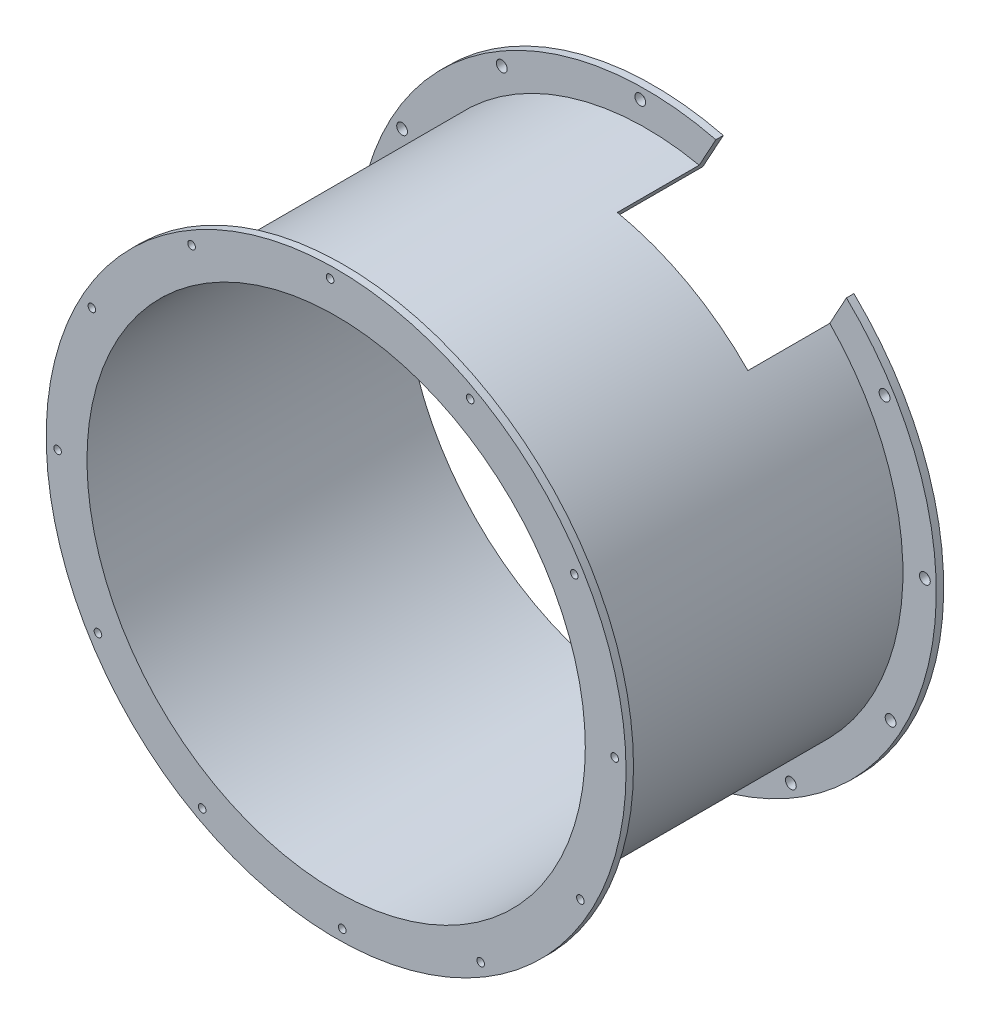
ISO-10303-21;
HEADER;
FILE_DESCRIPTION(('STEP AP214'),'2;1');
FILE_NAME('part.step','',(''),(''),'','','');
FILE_SCHEMA(('AUTOMOTIVE_DESIGN { 1 0 10303 214 1 1 1 1 }'));
ENDSEC;
DATA;
#1=APPLICATION_CONTEXT('core data for automotive mechanical design processes');
#2=APPLICATION_PROTOCOL_DEFINITION('international standard','automotive_design',2000,#1);
#3=PRODUCT_CONTEXT('',#1,'mechanical');
#4=PRODUCT('Part','Part','',(#3));
#5=PRODUCT_RELATED_PRODUCT_CATEGORY('part','',(#4));
#6=PRODUCT_DEFINITION_FORMATION('','',#4);
#7=PRODUCT_DEFINITION_CONTEXT('part definition',#1,'design');
#8=PRODUCT_DEFINITION('design','',#6,#7);
#9=PRODUCT_DEFINITION_SHAPE('','',#8);
#10=(LENGTH_UNIT() NAMED_UNIT(*) SI_UNIT(.MILLI.,.METRE.));
#11=(NAMED_UNIT(*) PLANE_ANGLE_UNIT() SI_UNIT($,.RADIAN.));
#12=(NAMED_UNIT(*) SI_UNIT($,.STERADIAN.) SOLID_ANGLE_UNIT());
#13=UNCERTAINTY_MEASURE_WITH_UNIT(LENGTH_MEASURE(1.E-05),#10,'distance_accuracy_value','');
#14=(GEOMETRIC_REPRESENTATION_CONTEXT(3) GLOBAL_UNCERTAINTY_ASSIGNED_CONTEXT((#13)) GLOBAL_UNIT_ASSIGNED_CONTEXT((#10,
#11,#12)) REPRESENTATION_CONTEXT('',''));
#15=CARTESIAN_POINT('',(0.,0.,0.));
#16=DIRECTION('',(0.,0.,1.));
#17=DIRECTION('',(1.,0.,0.));
#18=AXIS2_PLACEMENT_3D('',#15,#16,#17);
#19=CARTESIAN_POINT('',(0.,0.,-108.88502705223));
#20=DIRECTION('',(0.,0.,-1.));
#21=DIRECTION('',(-1.,0.,0.));
#22=AXIS2_PLACEMENT_3D('',#19,#20,#21);
#23=PLANE('',#22);
#24=CARTESIAN_POINT('',(-84.2552932690104,-59.1010315433568,-108.88502705223));
#25=DIRECTION('',(0.,0.,1.));
#26=DIRECTION('',(1.,0.,0.));
#27=AXIS2_PLACEMENT_3D('',#24,#25,#26);
#28=CIRCLE('',#27,1.45);
#29=CARTESIAN_POINT('',(-82.8052932690104,-59.1010315433568,-108.88502705223));
#30=VERTEX_POINT('',#29);
#31=EDGE_CURVE('E274',#30,#30,#28,.T.);
#32=ORIENTED_EDGE('',*,*,#31,.F.);
#33=EDGE_LOOP('',(#32));
#34=FACE_BOUND('',#33,.T.);
#35=CARTESIAN_POINT('',(-57.4334190667852,-31.0833742869837,-108.88502705223));
#36=DIRECTION('',(0.,0.,1.));
#37=DIRECTION('',(1.,0.,0.));
#38=AXIS2_PLACEMENT_3D('',#35,#36,#37);
#39=CIRCLE('',#38,1.45);
#40=CARTESIAN_POINT('',(-55.9834190667852,-31.0833742869837,-108.88502705223));
#41=VERTEX_POINT('',#40);
#42=EDGE_CURVE('E268',#41,#41,#39,.T.);
#43=ORIENTED_EDGE('',*,*,#42,.F.);
#44=EDGE_LOOP('',(#43));
#45=FACE_BOUND('',#44,.T.);
#46=CARTESIAN_POINT('',(-48.2138232587343,6.5915657526732,-108.88502705223));
#47=DIRECTION('',(0.,0.,1.));
#48=DIRECTION('',(1.,0.,0.));
#49=AXIS2_PLACEMENT_3D('',#46,#47,#48);
#50=CIRCLE('',#49,1.45);
#51=CARTESIAN_POINT('',(-46.7638232587343,6.5915657526732,-108.88502705223));
#52=VERTEX_POINT('',#51);
#53=EDGE_CURVE('E262',#52,#52,#50,.T.);
#54=ORIENTED_EDGE('',*,*,#53,.F.);
#55=EDGE_LOOP('',(#54));
#56=FACE_BOUND('',#55,.T.);
#57=CARTESIAN_POINT('',(-124.759486392196,79.8702888273732,-108.88502705223));
#58=DIRECTION('',(0.,0.,1.));
#59=DIRECTION('',(1.,0.,0.));
#60=AXIS2_PLACEMENT_3D('',#57,#58,#59);
#61=CIRCLE('',#60,1.45);
#62=CARTESIAN_POINT('',(-123.309486392196,79.8702888273732,-108.88502705223));
#63=VERTEX_POINT('',#62);
#64=EDGE_CURVE('E253',#63,#63,#61,.T.);
#65=ORIENTED_EDGE('',*,*,#64,.F.);
#66=EDGE_LOOP('',(#65));
#67=FACE_BOUND('',#66,.T.);
#68=CARTESIAN_POINT('',(-161.99673945662,69.0172229899414,-108.88502705223));
#69=DIRECTION('',(0.,0.,1.));
#70=DIRECTION('',(1.,0.,0.));
#71=AXIS2_PLACEMENT_3D('',#68,#69,#70);
#72=CIRCLE('',#71,1.45);
#73=CARTESIAN_POINT('',(-160.54673945662,69.0172229899414,-108.88502705223));
#74=VERTEX_POINT('',#73);
#75=EDGE_CURVE('E247',#74,#74,#72,.T.);
#76=ORIENTED_EDGE('',*,*,#75,.F.);
#77=EDGE_LOOP('',(#76));
#78=FACE_BOUND('',#77,.T.);
#79=CARTESIAN_POINT('',(-188.818613658845,40.9995657335684,-108.88502705223));
#80=DIRECTION('',(0.,0.,1.));
#81=DIRECTION('',(1.,0.,0.));
#82=AXIS2_PLACEMENT_3D('',#79,#80,#81);
#83=CIRCLE('',#82,1.45);
#84=CARTESIAN_POINT('',(-187.368613658845,40.9995657335684,-108.88502705223));
#85=VERTEX_POINT('',#84);
#86=EDGE_CURVE('E241',#85,#85,#83,.T.);
#87=ORIENTED_EDGE('',*,*,#86,.F.);
#88=EDGE_LOOP('',(#87));
#89=FACE_BOUND('',#88,.T.);
#90=CARTESIAN_POINT('',(-198.038209466896,3.32462569391143,-108.88502705223));
#91=DIRECTION('',(0.,0.,1.));
#92=DIRECTION('',(1.,0.,0.));
#93=AXIS2_PLACEMENT_3D('',#90,#91,#92);
#94=CIRCLE('',#93,1.45);
#95=CARTESIAN_POINT('',(-196.588209466896,3.32462569391143,-108.88502705223));
#96=VERTEX_POINT('',#95);
#97=EDGE_CURVE('E235',#96,#96,#94,.T.);
#98=ORIENTED_EDGE('',*,*,#97,.F.);
#99=EDGE_LOOP('',(#98));
#100=FACE_BOUND('',#99,.T.);
#101=CARTESIAN_POINT('',(-187.185143629464,-33.9126273705125,-108.88502705223));
#102=DIRECTION('',(0.,0.,1.));
#103=DIRECTION('',(1.,0.,0.));
#104=AXIS2_PLACEMENT_3D('',#101,#102,#103);
#105=CIRCLE('',#104,1.45);
#106=CARTESIAN_POINT('',(-185.735143629464,-33.9126273705125,-108.88502705223));
#107=VERTEX_POINT('',#106);
#108=EDGE_CURVE('E229',#107,#107,#105,.T.);
#109=ORIENTED_EDGE('',*,*,#108,.F.);
#110=EDGE_LOOP('',(#109));
#111=FACE_BOUND('',#110,.T.);
#112=CARTESIAN_POINT('',(-121.492546333434,-69.9540973807886,-108.88502705223));
#113=DIRECTION('',(0.,0.,1.));
#114=DIRECTION('',(1.,0.,0.));
#115=AXIS2_PLACEMENT_3D('',#112,#113,#114);
#116=CIRCLE('',#115,1.45);
#117=CARTESIAN_POINT('',(-120.042546333434,-69.9540973807886,-108.88502705223));
#118=VERTEX_POINT('',#117);
#119=EDGE_CURVE('E223',#118,#118,#116,.T.);
#120=ORIENTED_EDGE('',*,*,#119,.F.);
#121=EDGE_LOOP('',(#120));
#122=FACE_BOUND('',#121,.T.);
#123=CARTESIAN_POINT('',(-159.167486373091,-60.7345015727377,-108.88502705223));
#124=DIRECTION('',(0.,0.,1.));
#125=DIRECTION('',(1.,0.,0.));
#126=AXIS2_PLACEMENT_3D('',#123,#124,#125);
#127=CIRCLE('',#126,1.45);
#128=CARTESIAN_POINT('',(-157.717486373092,-60.7345015727377,-108.88502705223));
#129=VERTEX_POINT('',#128);
#130=EDGE_CURVE('E217',#129,#129,#127,.T.);
#131=ORIENTED_EDGE('',*,*,#130,.F.);
#132=EDGE_LOOP('',(#131));
#133=FACE_BOUND('',#132,.T.);
#134=CARTESIAN_POINT('',(-123.126016362815,4.95809572329235,-108.88502705223));
#135=DIRECTION('',(0.,0.,-1.));
#136=DIRECTION('',(-1.,0.,0.));
#137=AXIS2_PLACEMENT_3D('',#134,#135,#136);
#138=CIRCLE('',#137,69.0115996692059);
#139=CARTESIAN_POINT('',(-73.7894198728316,53.2126409567445,-108.88502705223));
#140=VERTEX_POINT('',#139);
#141=CARTESIAN_POINT('',(-108.90676901167,72.4889323364255,-108.88502705223));
#142=VERTEX_POINT('',#141);
#143=EDGE_CURVE('E92',#140,#142,#138,.T.);
#144=ORIENTED_EDGE('',*,*,#143,.T.);
#145=DIRECTION('',(0.481087899206272,0.876672363678299,0.));
#146=VECTOR('',#145,1.);
#147=CARTESIAN_POINT('',(-114.273456040525,62.7093760215189,-108.88502705223));
#148=LINE('',#147,#146);
#149=CARTESIAN_POINT('',(-104.422834049352,80.6598754602929,-108.88502705223));
#150=VERTEX_POINT('',#149);
#151=EDGE_CURVE('E26',#142,#150,#148,.T.);
#152=ORIENTED_EDGE('',*,*,#151,.T.);
#153=CARTESIAN_POINT('',(-123.126016362815,4.95809572329235,-108.88502705223));
#154=DIRECTION('',(0.,0.,-1.));
#155=DIRECTION('',(-1.,0.,0.));
#156=AXIS2_PLACEMENT_3D('',#153,#154,#155);
#157=CIRCLE('',#156,77.978);
#158=CARTESIAN_POINT('',(-69.3052195252026,61.3840676844774,-108.88502705223));
#159=VERTEX_POINT('',#158);
#160=EDGE_CURVE('E118',#159,#150,#157,.T.);
#161=ORIENTED_EDGE('',*,*,#160,.F.);
#162=DIRECTION('',(-0.481087899206272,-0.876672363678299,0.));
#163=VECTOR('',#162,1.);
#164=CARTESIAN_POINT('',(-79.1539611515719,43.4369947793157,-108.88502705223));
#165=LINE('',#164,#163);
#166=EDGE_CURVE('E126',#159,#140,#165,.T.);
#167=ORIENTED_EDGE('',*,*,#166,.T.);
#168=EDGE_LOOP('',(#144,#152,#161,#167));
#169=FACE_BOUND('',#168,.T.);
#170=CARTESIAN_POINT('',(-59.0668890961661,43.8288188170972,-108.88502705223));
#171=DIRECTION('',(0.,0.,1.));
#172=DIRECTION('',(1.,0.,0.));
#173=AXIS2_PLACEMENT_3D('',#170,#171,#172);
#174=CIRCLE('',#173,1.45);
#175=CARTESIAN_POINT('',(-57.6168890961661,43.8288188170972,-108.88502705223));
#176=VERTEX_POINT('',#175);
#177=EDGE_CURVE('E259',#176,#176,#174,.T.);
#178=ORIENTED_EDGE('',*,*,#177,.F.);
#179=EDGE_LOOP('',(#178));
#180=FACE_BOUND('',#179,.T.);
#181=ADVANCED_FACE('F17',(#34,#45,#56,#67,#78,#89,#100,#111,#122,#133,#169,#180),#23,.F.);
#182=CARTESIAN_POINT('',(-123.126016362815,4.95809572329235,45.));
#183=DIRECTION('',(0.,0.,-1.));
#184=DIRECTION('',(-1.,0.,0.));
#185=AXIS2_PLACEMENT_3D('',#182,#183,#184);
#186=CYLINDRICAL_SURFACE('',#185,69.0115996692059);
#187=DIRECTION('',(0.,0.,-1.));
#188=VECTOR('',#187,1.);
#189=CARTESIAN_POINT('',(-108.90676901167,72.4889323364255,45.));
#190=LINE('',#189,#188);
#191=CARTESIAN_POINT('',(-108.90676901167,72.4889323364255,-86.8650270522294));
#192=VERTEX_POINT('',#191);
#193=EDGE_CURVE('E101',#142,#192,#190,.F.);
#194=ORIENTED_EDGE('',*,*,#193,.F.);
#195=ORIENTED_EDGE('',*,*,#143,.F.);
#196=DIRECTION('',(0.,0.,-1.));
#197=VECTOR('',#196,1.);
#198=CARTESIAN_POINT('',(-73.7894198728316,53.2126409567445,45.));
#199=LINE('',#198,#197);
#200=CARTESIAN_POINT('',(-73.7894198728316,53.2126409567445,-86.8650270522294));
#201=VERTEX_POINT('',#200);
#202=EDGE_CURVE('E33',#201,#140,#199,.T.);
#203=ORIENTED_EDGE('',*,*,#202,.F.);
#204=CARTESIAN_POINT('',(-123.126016362815,4.95809572329235,-86.8650270522294));
#205=DIRECTION('',(0.,0.,-1.));
#206=DIRECTION('',(0.,1.,0.));
#207=AXIS2_PLACEMENT_3D('',#204,#205,#206);
#208=CIRCLE('',#207,69.0115996692059);
#209=EDGE_CURVE('E72',#201,#192,#208,.F.);
#210=ORIENTED_EDGE('',*,*,#209,.T.);
#211=EDGE_LOOP('',(#194,#195,#203,#210));
#212=FACE_BOUND('',#211,.T.);
#213=CARTESIAN_POINT('',(-123.126016362815,4.95809572329235,-27.4593849588588));
#214=DIRECTION('',(0.,0.,1.));
#215=DIRECTION('',(1.,0.,0.));
#216=AXIS2_PLACEMENT_3D('',#213,#214,#215);
#217=CIRCLE('',#216,69.0115996692059);
#218=CARTESIAN_POINT('',(-54.1144166936093,4.95809572329235,-27.4593849588588));
#219=VERTEX_POINT('',#218);
#220=EDGE_CURVE('E111',#219,#219,#217,.F.);
#221=ORIENTED_EDGE('',*,*,#220,.T.);
#222=EDGE_LOOP('',(#221));
#223=FACE_BOUND('',#222,.T.);
#224=ADVANCED_FACE('F89',(#212,#223),#186,.T.);
#225=CARTESIAN_POINT('',(-123.126016362815,4.95809572329235,3.));
#226=DIRECTION('',(0.,0.,-1.));
#227=DIRECTION('',(-1.,0.,0.));
#228=AXIS2_PLACEMENT_3D('',#225,#226,#227);
#229=CYLINDRICAL_SURFACE('',#228,67.0115996692059);
#230=CARTESIAN_POINT('',(-123.126016362815,4.95809572329235,-110.88502705223));
#231=DIRECTION('',(0.,0.,1.));
#232=DIRECTION('',(1.,0.,0.));
#233=AXIS2_PLACEMENT_3D('',#230,#231,#232);
#234=CIRCLE('',#233,67.0115996692059);
#235=CARTESIAN_POINT('',(-109.913575106506,70.6542591293428,-110.88502705223));
#236=VERTEX_POINT('',#235);
#237=CARTESIAN_POINT('',(-74.7962961921203,51.3778397817018,-110.88502705223));
#238=VERTEX_POINT('',#237);
#239=EDGE_CURVE('E121',#236,#238,#234,.T.);
#240=ORIENTED_EDGE('',*,*,#239,.F.);
#241=DIRECTION('',(0.,0.,-1.));
#242=VECTOR('',#241,1.);
#243=CARTESIAN_POINT('',(-109.913575106506,70.6542591293428,3.));
#244=LINE('',#243,#242);
#245=CARTESIAN_POINT('',(-109.913575106506,70.6542591293428,-86.8650270522294));
#246=VERTEX_POINT('',#245);
#247=EDGE_CURVE('E81',#236,#246,#244,.F.);
#248=ORIENTED_EDGE('',*,*,#247,.T.);
#249=CARTESIAN_POINT('',(-123.126016362815,4.95809572329235,-86.8650270522294));
#250=DIRECTION('',(0.,0.,-1.));
#251=DIRECTION('',(0.,1.,0.));
#252=AXIS2_PLACEMENT_3D('',#249,#250,#251);
#253=CIRCLE('',#252,67.0115996692059);
#254=CARTESIAN_POINT('',(-74.7962961921203,51.3778397817018,-86.8650270522294));
#255=VERTEX_POINT('',#254);
#256=EDGE_CURVE('E11',#255,#246,#253,.F.);
#257=ORIENTED_EDGE('',*,*,#256,.F.);
#258=DIRECTION('',(0.,0.,-1.));
#259=VECTOR('',#258,1.);
#260=CARTESIAN_POINT('',(-74.7962961921203,51.3778397817018,3.));
#261=LINE('',#260,#259);
#262=EDGE_CURVE('E85',#255,#238,#261,.T.);
#263=ORIENTED_EDGE('',*,*,#262,.T.);
#264=EDGE_LOOP('',(#240,#248,#257,#263));
#265=FACE_BOUND('',#264,.T.);
#266=CARTESIAN_POINT('',(-123.126016362815,4.95809572329235,-25.4593849588588));
#267=DIRECTION('',(0.,0.,1.));
#268=DIRECTION('',(1.,0.,0.));
#269=AXIS2_PLACEMENT_3D('',#266,#267,#268);
#270=CIRCLE('',#269,67.0115996692059);
#271=CARTESIAN_POINT('',(-56.1144166936093,4.95809572329235,-25.4593849588588));
#272=VERTEX_POINT('',#271);
#273=EDGE_CURVE('E108',#272,#272,#270,.F.);
#274=ORIENTED_EDGE('',*,*,#273,.F.);
#275=EDGE_LOOP('',(#274));
#276=FACE_BOUND('',#275,.T.);
#277=ADVANCED_FACE('F311',(#265,#276),#229,.F.);
#278=CARTESIAN_POINT('',(-123.126016362815,4.95809572329235,-110.88502705223));
#279=DIRECTION('',(0.,0.,1.));
#280=DIRECTION('',(1.,0.,0.));
#281=AXIS2_PLACEMENT_3D('',#278,#279,#280);
#282=PLANE('',#281);
#283=CARTESIAN_POINT('',(-84.2552932690104,-59.1010315433568,-110.88502705223));
#284=DIRECTION('',(0.,0.,1.));
#285=DIRECTION('',(1.,0.,0.));
#286=AXIS2_PLACEMENT_3D('',#283,#284,#285);
#287=CIRCLE('',#286,1.45);
#288=CARTESIAN_POINT('',(-82.8052932690104,-59.1010315433568,-110.88502705223));
#289=VERTEX_POINT('',#288);
#290=EDGE_CURVE('E271',#289,#289,#287,.T.);
#291=ORIENTED_EDGE('',*,*,#290,.T.);
#292=EDGE_LOOP('',(#291));
#293=FACE_BOUND('',#292,.T.);
#294=CARTESIAN_POINT('',(-57.4334190667852,-31.0833742869837,-110.88502705223));
#295=DIRECTION('',(0.,0.,1.));
#296=DIRECTION('',(1.,0.,0.));
#297=AXIS2_PLACEMENT_3D('',#294,#295,#296);
#298=CIRCLE('',#297,1.45);
#299=CARTESIAN_POINT('',(-55.9834190667852,-31.0833742869837,-110.88502705223));
#300=VERTEX_POINT('',#299);
#301=EDGE_CURVE('E265',#300,#300,#298,.T.);
#302=ORIENTED_EDGE('',*,*,#301,.T.);
#303=EDGE_LOOP('',(#302));
#304=FACE_BOUND('',#303,.T.);
#305=CARTESIAN_POINT('',(-48.2138232587343,6.5915657526732,-110.88502705223));
#306=DIRECTION('',(0.,0.,1.));
#307=DIRECTION('',(1.,0.,0.));
#308=AXIS2_PLACEMENT_3D('',#305,#306,#307);
#309=CIRCLE('',#308,1.45);
#310=CARTESIAN_POINT('',(-46.7638232587343,6.5915657526732,-110.88502705223));
#311=VERTEX_POINT('',#310);
#312=EDGE_CURVE('E21',#311,#311,#309,.T.);
#313=ORIENTED_EDGE('',*,*,#312,.T.);
#314=EDGE_LOOP('',(#313));
#315=FACE_BOUND('',#314,.T.);
#316=CARTESIAN_POINT('',(-59.0668890961661,43.8288188170972,-110.88502705223));
#317=DIRECTION('',(0.,0.,1.));
#318=DIRECTION('',(1.,0.,0.));
#319=AXIS2_PLACEMENT_3D('',#316,#317,#318);
#320=CIRCLE('',#319,1.45);
#321=CARTESIAN_POINT('',(-57.6168890961661,43.8288188170972,-110.88502705223));
#322=VERTEX_POINT('',#321);
#323=EDGE_CURVE('E256',#322,#322,#320,.T.);
#324=ORIENTED_EDGE('',*,*,#323,.T.);
#325=EDGE_LOOP('',(#324));
#326=FACE_BOUND('',#325,.T.);
#327=CARTESIAN_POINT('',(-124.759486392196,79.8702888273732,-110.88502705223));
#328=DIRECTION('',(0.,0.,1.));
#329=DIRECTION('',(1.,0.,0.));
#330=AXIS2_PLACEMENT_3D('',#327,#328,#329);
#331=CIRCLE('',#330,1.45);
#332=CARTESIAN_POINT('',(-123.309486392196,79.8702888273732,-110.88502705223));
#333=VERTEX_POINT('',#332);
#334=EDGE_CURVE('E250',#333,#333,#331,.T.);
#335=ORIENTED_EDGE('',*,*,#334,.T.);
#336=EDGE_LOOP('',(#335));
#337=FACE_BOUND('',#336,.T.);
#338=CARTESIAN_POINT('',(-161.99673945662,69.0172229899414,-110.88502705223));
#339=DIRECTION('',(0.,0.,1.));
#340=DIRECTION('',(1.,0.,0.));
#341=AXIS2_PLACEMENT_3D('',#338,#339,#340);
#342=CIRCLE('',#341,1.45);
#343=CARTESIAN_POINT('',(-160.54673945662,69.0172229899414,-110.88502705223));
#344=VERTEX_POINT('',#343);
#345=EDGE_CURVE('E244',#344,#344,#342,.T.);
#346=ORIENTED_EDGE('',*,*,#345,.T.);
#347=EDGE_LOOP('',(#346));
#348=FACE_BOUND('',#347,.T.);
#349=CARTESIAN_POINT('',(-188.818613658845,40.9995657335684,-110.88502705223));
#350=DIRECTION('',(0.,0.,1.));
#351=DIRECTION('',(1.,0.,0.));
#352=AXIS2_PLACEMENT_3D('',#349,#350,#351);
#353=CIRCLE('',#352,1.45);
#354=CARTESIAN_POINT('',(-187.368613658845,40.9995657335684,-110.88502705223));
#355=VERTEX_POINT('',#354);
#356=EDGE_CURVE('E238',#355,#355,#353,.T.);
#357=ORIENTED_EDGE('',*,*,#356,.T.);
#358=EDGE_LOOP('',(#357));
#359=FACE_BOUND('',#358,.T.);
#360=CARTESIAN_POINT('',(-198.038209466896,3.32462569391143,-110.88502705223));
#361=DIRECTION('',(0.,0.,1.));
#362=DIRECTION('',(1.,0.,0.));
#363=AXIS2_PLACEMENT_3D('',#360,#361,#362);
#364=CIRCLE('',#363,1.45);
#365=CARTESIAN_POINT('',(-196.588209466896,3.32462569391143,-110.88502705223));
#366=VERTEX_POINT('',#365);
#367=EDGE_CURVE('E232',#366,#366,#364,.T.);
#368=ORIENTED_EDGE('',*,*,#367,.T.);
#369=EDGE_LOOP('',(#368));
#370=FACE_BOUND('',#369,.T.);
#371=CARTESIAN_POINT('',(-187.185143629464,-33.9126273705125,-110.88502705223));
#372=DIRECTION('',(0.,0.,1.));
#373=DIRECTION('',(1.,0.,0.));
#374=AXIS2_PLACEMENT_3D('',#371,#372,#373);
#375=CIRCLE('',#374,1.45);
#376=CARTESIAN_POINT('',(-185.735143629464,-33.9126273705125,-110.88502705223));
#377=VERTEX_POINT('',#376);
#378=EDGE_CURVE('E226',#377,#377,#375,.T.);
#379=ORIENTED_EDGE('',*,*,#378,.T.);
#380=EDGE_LOOP('',(#379));
#381=FACE_BOUND('',#380,.T.);
#382=CARTESIAN_POINT('',(-121.492546333434,-69.9540973807886,-110.88502705223));
#383=DIRECTION('',(0.,0.,1.));
#384=DIRECTION('',(1.,0.,0.));
#385=AXIS2_PLACEMENT_3D('',#382,#383,#384);
#386=CIRCLE('',#385,1.45);
#387=CARTESIAN_POINT('',(-120.042546333434,-69.9540973807886,-110.88502705223));
#388=VERTEX_POINT('',#387);
#389=EDGE_CURVE('E220',#388,#388,#386,.T.);
#390=ORIENTED_EDGE('',*,*,#389,.T.);
#391=EDGE_LOOP('',(#390));
#392=FACE_BOUND('',#391,.T.);
#393=CARTESIAN_POINT('',(-159.167486373091,-60.7345015727377,-110.88502705223));
#394=DIRECTION('',(0.,0.,1.));
#395=DIRECTION('',(1.,0.,0.));
#396=AXIS2_PLACEMENT_3D('',#393,#394,#395);
#397=CIRCLE('',#396,1.45);
#398=CARTESIAN_POINT('',(-157.717486373092,-60.7345015727377,-110.88502705223));
#399=VERTEX_POINT('',#398);
#400=EDGE_CURVE('E214',#399,#399,#397,.T.);
#401=ORIENTED_EDGE('',*,*,#400,.T.);
#402=EDGE_LOOP('',(#401));
#403=FACE_BOUND('',#402,.T.);
#404=CARTESIAN_POINT('',(-123.126016362815,4.95809572329235,-110.88502705223));
#405=DIRECTION('',(0.,0.,-1.));
#406=DIRECTION('',(-1.,0.,0.));
#407=AXIS2_PLACEMENT_3D('',#404,#405,#406);
#408=CIRCLE('',#407,77.978);
#409=CARTESIAN_POINT('',(-69.3052195252026,61.3840676844773,-110.88502705223));
#410=VERTEX_POINT('',#409);
#411=CARTESIAN_POINT('',(-104.422834049351,80.6598754602929,-110.88502705223));
#412=VERTEX_POINT('',#411);
#413=EDGE_CURVE('E116',#410,#412,#408,.T.);
#414=ORIENTED_EDGE('',*,*,#413,.T.);
#415=DIRECTION('',(-0.481087899206272,-0.876672363678299,0.));
#416=VECTOR('',#415,1.);
#417=CARTESIAN_POINT('',(-99.1991805644907,90.1787859445615,-110.88502705223));
#418=LINE('',#417,#416);
#419=EDGE_CURVE('E96',#412,#236,#418,.T.);
#420=ORIENTED_EDGE('',*,*,#419,.T.);
#421=ORIENTED_EDGE('',*,*,#239,.T.);
#422=DIRECTION('',(0.481087899206272,0.876672363678299,0.));
#423=VECTOR('',#422,1.);
#424=CARTESIAN_POINT('',(-84.9021321289838,32.9622714576343,-110.88502705223));
#425=LINE('',#424,#423);
#426=EDGE_CURVE('E86',#238,#410,#425,.T.);
#427=ORIENTED_EDGE('',*,*,#426,.T.);
#428=EDGE_LOOP('',(#414,#420,#421,#427));
#429=FACE_BOUND('',#428,.T.);
#430=ADVANCED_FACE('F19',(#293,#304,#315,#326,#337,#348,#359,#370,#381,#392,#403,#429),#282,.F.);
#431=CARTESIAN_POINT('',(-123.126016362815,4.95809572329235,-108.88502705223));
#432=DIRECTION('',(0.,0.,-1.));
#433=DIRECTION('',(-1.,0.,0.));
#434=AXIS2_PLACEMENT_3D('',#431,#432,#433);
#435=CYLINDRICAL_SURFACE('',#434,77.978);
#436=DIRECTION('',(0.,0.,-1.));
#437=VECTOR('',#436,1.);
#438=CARTESIAN_POINT('',(-104.422834049351,80.6598754602929,-108.88502705223));
#439=LINE('',#438,#437);
#440=EDGE_CURVE('E41',#412,#150,#439,.F.);
#441=ORIENTED_EDGE('',*,*,#440,.F.);
#442=ORIENTED_EDGE('',*,*,#413,.F.);
#443=DIRECTION('',(0.,0.,-1.));
#444=VECTOR('',#443,1.);
#445=CARTESIAN_POINT('',(-69.3052195252026,61.3840676844773,-108.88502705223));
#446=LINE('',#445,#444);
#447=EDGE_CURVE('E93',#159,#410,#446,.T.);
#448=ORIENTED_EDGE('',*,*,#447,.F.);
#449=ORIENTED_EDGE('',*,*,#160,.T.);
#450=EDGE_LOOP('',(#441,#442,#448,#449));
#451=FACE_BOUND('',#450,.T.);
#452=ADVANCED_FACE('F133',(#451),#435,.T.);
#453=CARTESIAN_POINT('',(-123.126016362815,4.95809572329235,-25.4593849588588));
#454=DIRECTION('',(0.,0.,-1.));
#455=DIRECTION('',(-1.,0.,0.));
#456=AXIS2_PLACEMENT_3D('',#453,#454,#455);
#457=CYLINDRICAL_SURFACE('',#456,77.978);
#458=CARTESIAN_POINT('',(-123.126016362815,4.95809572329235,-25.4593849588588));
#459=DIRECTION('',(0.,0.,1.));
#460=DIRECTION('',(1.,0.,0.));
#461=AXIS2_PLACEMENT_3D('',#458,#459,#460);
#462=CIRCLE('',#461,77.978);
#463=CARTESIAN_POINT('',(-45.1480163628152,4.95809572329235,-25.4593849588588));
#464=VERTEX_POINT('',#463);
#465=EDGE_CURVE('E105',#464,#464,#462,.T.);
#466=ORIENTED_EDGE('',*,*,#465,.F.);
#467=EDGE_LOOP('',(#466));
#468=FACE_BOUND('',#467,.T.);
#469=CARTESIAN_POINT('',(-123.126016362815,4.95809572329235,-27.4593849588588));
#470=DIRECTION('',(0.,0.,1.));
#471=DIRECTION('',(1.,0.,0.));
#472=AXIS2_PLACEMENT_3D('',#469,#470,#471);
#473=CIRCLE('',#472,77.978);
#474=CARTESIAN_POINT('',(-45.1480163628152,4.95809572329235,-27.4593849588588));
#475=VERTEX_POINT('',#474);
#476=EDGE_CURVE('E80',#475,#475,#473,.T.);
#477=ORIENTED_EDGE('',*,*,#476,.T.);
#478=EDGE_LOOP('',(#477));
#479=FACE_BOUND('',#478,.T.);
#480=ADVANCED_FACE('F319',(#468,#479),#457,.T.);
#481=CARTESIAN_POINT('',(0.,0.,-25.4593849588588));
#482=DIRECTION('',(0.,0.,1.));
#483=DIRECTION('',(1.,0.,0.));
#484=AXIS2_PLACEMENT_3D('',#481,#482,#483);
#485=PLANE('',#484);
#486=CARTESIAN_POINT('',(-57.4334190667852,-31.0833742869837,-25.4593849588588));
#487=DIRECTION('',(0.,0.,1.));
#488=DIRECTION('',(1.,0.,0.));
#489=AXIS2_PLACEMENT_3D('',#486,#487,#488);
#490=CIRCLE('',#489,1.025);
#491=CARTESIAN_POINT('',(-56.4084190667852,-31.0833742869837,-25.4593849588588));
#492=VERTEX_POINT('',#491);
#493=EDGE_CURVE('E211',#492,#492,#490,.T.);
#494=ORIENTED_EDGE('',*,*,#493,.F.);
#495=EDGE_LOOP('',(#494));
#496=FACE_BOUND('',#495,.T.);
#497=CARTESIAN_POINT('',(-84.2552932690104,-59.1010315433568,-25.4593849588588));
#498=DIRECTION('',(0.,0.,1.));
#499=DIRECTION('',(1.,0.,0.));
#500=AXIS2_PLACEMENT_3D('',#497,#498,#499);
#501=CIRCLE('',#500,1.025);
#502=CARTESIAN_POINT('',(-83.2302932690104,-59.1010315433568,-25.4593849588588));
#503=VERTEX_POINT('',#502);
#504=EDGE_CURVE('E205',#503,#503,#501,.T.);
#505=ORIENTED_EDGE('',*,*,#504,.F.);
#506=EDGE_LOOP('',(#505));
#507=FACE_BOUND('',#506,.T.);
#508=CARTESIAN_POINT('',(-121.492546333434,-69.9540973807886,-25.4593849588588));
#509=DIRECTION('',(0.,0.,1.));
#510=DIRECTION('',(1.,0.,0.));
#511=AXIS2_PLACEMENT_3D('',#508,#509,#510);
#512=CIRCLE('',#511,1.025);
#513=CARTESIAN_POINT('',(-120.467546333434,-69.9540973807886,-25.4593849588588));
#514=VERTEX_POINT('',#513);
#515=EDGE_CURVE('E199',#514,#514,#512,.T.);
#516=ORIENTED_EDGE('',*,*,#515,.F.);
#517=EDGE_LOOP('',(#516));
#518=FACE_BOUND('',#517,.T.);
#519=CARTESIAN_POINT('',(-159.167486373091,-60.7345015727377,-25.4593849588588));
#520=DIRECTION('',(0.,0.,1.));
#521=DIRECTION('',(1.,0.,0.));
#522=AXIS2_PLACEMENT_3D('',#519,#520,#521);
#523=CIRCLE('',#522,1.025);
#524=CARTESIAN_POINT('',(-158.142486373092,-60.7345015727377,-25.4593849588588));
#525=VERTEX_POINT('',#524);
#526=EDGE_CURVE('E193',#525,#525,#523,.T.);
#527=ORIENTED_EDGE('',*,*,#526,.F.);
#528=EDGE_LOOP('',(#527));
#529=FACE_BOUND('',#528,.T.);
#530=CARTESIAN_POINT('',(-187.185143629464,-33.9126273705125,-25.4593849588588));
#531=DIRECTION('',(0.,0.,1.));
#532=DIRECTION('',(1.,0.,0.));
#533=AXIS2_PLACEMENT_3D('',#530,#531,#532);
#534=CIRCLE('',#533,1.025);
#535=CARTESIAN_POINT('',(-186.160143629464,-33.9126273705125,-25.4593849588588));
#536=VERTEX_POINT('',#535);
#537=EDGE_CURVE('E187',#536,#536,#534,.T.);
#538=ORIENTED_EDGE('',*,*,#537,.F.);
#539=EDGE_LOOP('',(#538));
#540=FACE_BOUND('',#539,.T.);
#541=CARTESIAN_POINT('',(-198.038209466896,3.32462569391143,-25.4593849588588));
#542=DIRECTION('',(0.,0.,1.));
#543=DIRECTION('',(1.,0.,0.));
#544=AXIS2_PLACEMENT_3D('',#541,#542,#543);
#545=CIRCLE('',#544,1.025);
#546=CARTESIAN_POINT('',(-197.013209466896,3.32462569391143,-25.4593849588588));
#547=VERTEX_POINT('',#546);
#548=EDGE_CURVE('E181',#547,#547,#545,.T.);
#549=ORIENTED_EDGE('',*,*,#548,.F.);
#550=EDGE_LOOP('',(#549));
#551=FACE_BOUND('',#550,.T.);
#552=CARTESIAN_POINT('',(-188.818613658845,40.9995657335684,-25.4593849588588));
#553=DIRECTION('',(0.,0.,1.));
#554=DIRECTION('',(1.,0.,0.));
#555=AXIS2_PLACEMENT_3D('',#552,#553,#554);
#556=CIRCLE('',#555,1.025);
#557=CARTESIAN_POINT('',(-187.793613658845,40.9995657335684,-25.4593849588588));
#558=VERTEX_POINT('',#557);
#559=EDGE_CURVE('E175',#558,#558,#556,.T.);
#560=ORIENTED_EDGE('',*,*,#559,.F.);
#561=EDGE_LOOP('',(#560));
#562=FACE_BOUND('',#561,.T.);
#563=CARTESIAN_POINT('',(-161.99673945662,69.0172229899414,-25.4593849588588));
#564=DIRECTION('',(0.,0.,1.));
#565=DIRECTION('',(1.,0.,0.));
#566=AXIS2_PLACEMENT_3D('',#563,#564,#565);
#567=CIRCLE('',#566,1.025);
#568=CARTESIAN_POINT('',(-160.97173945662,69.0172229899414,-25.4593849588588));
#569=VERTEX_POINT('',#568);
#570=EDGE_CURVE('E169',#569,#569,#567,.T.);
#571=ORIENTED_EDGE('',*,*,#570,.F.);
#572=EDGE_LOOP('',(#571));
#573=FACE_BOUND('',#572,.T.);
#574=CARTESIAN_POINT('',(-124.759486392196,79.8702888273732,-25.4593849588588));
#575=DIRECTION('',(0.,0.,1.));
#576=DIRECTION('',(1.,0.,0.));
#577=AXIS2_PLACEMENT_3D('',#574,#575,#576);
#578=CIRCLE('',#577,1.025);
#579=CARTESIAN_POINT('',(-123.734486392196,79.8702888273732,-25.4593849588588));
#580=VERTEX_POINT('',#579);
#581=EDGE_CURVE('E163',#580,#580,#578,.T.);
#582=ORIENTED_EDGE('',*,*,#581,.F.);
#583=EDGE_LOOP('',(#582));
#584=FACE_BOUND('',#583,.T.);
#585=CARTESIAN_POINT('',(-87.0845463525391,70.6506930193223,-25.4593849588588));
#586=DIRECTION('',(0.,0.,1.));
#587=DIRECTION('',(1.,0.,0.));
#588=AXIS2_PLACEMENT_3D('',#585,#586,#587);
#589=CIRCLE('',#588,1.025);
#590=CARTESIAN_POINT('',(-86.0595463525391,70.6506930193223,-25.4593849588588));
#591=VERTEX_POINT('',#590);
#592=EDGE_CURVE('E157',#591,#591,#589,.T.);
#593=ORIENTED_EDGE('',*,*,#592,.F.);
#594=EDGE_LOOP('',(#593));
#595=FACE_BOUND('',#594,.T.);
#596=CARTESIAN_POINT('',(-59.0668890961661,43.8288188170972,-25.4593849588588));
#597=DIRECTION('',(0.,0.,1.));
#598=DIRECTION('',(1.,0.,0.));
#599=AXIS2_PLACEMENT_3D('',#596,#597,#598);
#600=CIRCLE('',#599,1.025);
#601=CARTESIAN_POINT('',(-58.0418890961661,43.8288188170972,-25.4593849588588));
#602=VERTEX_POINT('',#601);
#603=EDGE_CURVE('E151',#602,#602,#600,.T.);
#604=ORIENTED_EDGE('',*,*,#603,.F.);
#605=EDGE_LOOP('',(#604));
#606=FACE_BOUND('',#605,.T.);
#607=CARTESIAN_POINT('',(-48.2138232587343,6.5915657526732,-25.4593849588588));
#608=DIRECTION('',(0.,0.,1.));
#609=DIRECTION('',(1.,0.,0.));
#610=AXIS2_PLACEMENT_3D('',#607,#608,#609);
#611=CIRCLE('',#610,1.025);
#612=CARTESIAN_POINT('',(-47.1888232587343,6.5915657526732,-25.4593849588588));
#613=VERTEX_POINT('',#612);
#614=EDGE_CURVE('E145',#613,#613,#611,.T.);
#615=ORIENTED_EDGE('',*,*,#614,.F.);
#616=EDGE_LOOP('',(#615));
#617=FACE_BOUND('',#616,.T.);
#618=ORIENTED_EDGE('',*,*,#465,.T.);
#619=EDGE_LOOP('',(#618));
#620=FACE_BOUND('',#619,.T.);
#621=ORIENTED_EDGE('',*,*,#273,.T.);
#622=EDGE_LOOP('',(#621));
#623=FACE_BOUND('',#622,.T.);
#624=ADVANCED_FACE('F411',(#496,#507,#518,#529,#540,#551,#562,#573,#584,#595,#606,#617,#620,
#623),#485,.T.);
#625=CARTESIAN_POINT('',(0.,0.,-27.4593849588588));
#626=DIRECTION('',(0.,0.,1.));
#627=DIRECTION('',(1.,0.,0.));
#628=AXIS2_PLACEMENT_3D('',#625,#626,#627);
#629=PLANE('',#628);
#630=CARTESIAN_POINT('',(-57.4334190667852,-31.0833742869837,-27.4593849588588));
#631=DIRECTION('',(0.,0.,1.));
#632=DIRECTION('',(1.,0.,0.));
#633=AXIS2_PLACEMENT_3D('',#630,#631,#632);
#634=CIRCLE('',#633,1.025);
#635=CARTESIAN_POINT('',(-56.4084190667852,-31.0833742869837,-27.4593849588588));
#636=VERTEX_POINT('',#635);
#637=EDGE_CURVE('E208',#636,#636,#634,.T.);
#638=ORIENTED_EDGE('',*,*,#637,.T.);
#639=EDGE_LOOP('',(#638));
#640=FACE_BOUND('',#639,.T.);
#641=CARTESIAN_POINT('',(-84.2552932690104,-59.1010315433568,-27.4593849588588));
#642=DIRECTION('',(0.,0.,1.));
#643=DIRECTION('',(1.,0.,0.));
#644=AXIS2_PLACEMENT_3D('',#641,#642,#643);
#645=CIRCLE('',#644,1.025);
#646=CARTESIAN_POINT('',(-83.2302932690104,-59.1010315433568,-27.4593849588588));
#647=VERTEX_POINT('',#646);
#648=EDGE_CURVE('E202',#647,#647,#645,.T.);
#649=ORIENTED_EDGE('',*,*,#648,.T.);
#650=EDGE_LOOP('',(#649));
#651=FACE_BOUND('',#650,.T.);
#652=CARTESIAN_POINT('',(-121.492546333434,-69.9540973807886,-27.4593849588588));
#653=DIRECTION('',(0.,0.,1.));
#654=DIRECTION('',(1.,0.,0.));
#655=AXIS2_PLACEMENT_3D('',#652,#653,#654);
#656=CIRCLE('',#655,1.025);
#657=CARTESIAN_POINT('',(-120.467546333434,-69.9540973807886,-27.4593849588588));
#658=VERTEX_POINT('',#657);
#659=EDGE_CURVE('E196',#658,#658,#656,.T.);
#660=ORIENTED_EDGE('',*,*,#659,.T.);
#661=EDGE_LOOP('',(#660));
#662=FACE_BOUND('',#661,.T.);
#663=CARTESIAN_POINT('',(-159.167486373091,-60.7345015727377,-27.4593849588588));
#664=DIRECTION('',(0.,0.,1.));
#665=DIRECTION('',(1.,0.,0.));
#666=AXIS2_PLACEMENT_3D('',#663,#664,#665);
#667=CIRCLE('',#666,1.025);
#668=CARTESIAN_POINT('',(-158.142486373092,-60.7345015727377,-27.4593849588588));
#669=VERTEX_POINT('',#668);
#670=EDGE_CURVE('E190',#669,#669,#667,.T.);
#671=ORIENTED_EDGE('',*,*,#670,.T.);
#672=EDGE_LOOP('',(#671));
#673=FACE_BOUND('',#672,.T.);
#674=CARTESIAN_POINT('',(-187.185143629464,-33.9126273705125,-27.4593849588588));
#675=DIRECTION('',(0.,0.,1.));
#676=DIRECTION('',(1.,0.,0.));
#677=AXIS2_PLACEMENT_3D('',#674,#675,#676);
#678=CIRCLE('',#677,1.025);
#679=CARTESIAN_POINT('',(-186.160143629464,-33.9126273705125,-27.4593849588588));
#680=VERTEX_POINT('',#679);
#681=EDGE_CURVE('E184',#680,#680,#678,.T.);
#682=ORIENTED_EDGE('',*,*,#681,.T.);
#683=EDGE_LOOP('',(#682));
#684=FACE_BOUND('',#683,.T.);
#685=CARTESIAN_POINT('',(-198.038209466896,3.32462569391143,-27.4593849588588));
#686=DIRECTION('',(0.,0.,1.));
#687=DIRECTION('',(1.,0.,0.));
#688=AXIS2_PLACEMENT_3D('',#685,#686,#687);
#689=CIRCLE('',#688,1.025);
#690=CARTESIAN_POINT('',(-197.013209466896,3.32462569391143,-27.4593849588588));
#691=VERTEX_POINT('',#690);
#692=EDGE_CURVE('E178',#691,#691,#689,.T.);
#693=ORIENTED_EDGE('',*,*,#692,.T.);
#694=EDGE_LOOP('',(#693));
#695=FACE_BOUND('',#694,.T.);
#696=CARTESIAN_POINT('',(-188.818613658845,40.9995657335684,-27.4593849588588));
#697=DIRECTION('',(0.,0.,1.));
#698=DIRECTION('',(1.,0.,0.));
#699=AXIS2_PLACEMENT_3D('',#696,#697,#698);
#700=CIRCLE('',#699,1.025);
#701=CARTESIAN_POINT('',(-187.793613658845,40.9995657335684,-27.4593849588588));
#702=VERTEX_POINT('',#701);
#703=EDGE_CURVE('E172',#702,#702,#700,.T.);
#704=ORIENTED_EDGE('',*,*,#703,.T.);
#705=EDGE_LOOP('',(#704));
#706=FACE_BOUND('',#705,.T.);
#707=CARTESIAN_POINT('',(-161.99673945662,69.0172229899414,-27.4593849588588));
#708=DIRECTION('',(0.,0.,1.));
#709=DIRECTION('',(1.,0.,0.));
#710=AXIS2_PLACEMENT_3D('',#707,#708,#709);
#711=CIRCLE('',#710,1.025);
#712=CARTESIAN_POINT('',(-160.97173945662,69.0172229899414,-27.4593849588588));
#713=VERTEX_POINT('',#712);
#714=EDGE_CURVE('E166',#713,#713,#711,.T.);
#715=ORIENTED_EDGE('',*,*,#714,.T.);
#716=EDGE_LOOP('',(#715));
#717=FACE_BOUND('',#716,.T.);
#718=CARTESIAN_POINT('',(-124.759486392196,79.8702888273732,-27.4593849588588));
#719=DIRECTION('',(0.,0.,1.));
#720=DIRECTION('',(1.,0.,0.));
#721=AXIS2_PLACEMENT_3D('',#718,#719,#720);
#722=CIRCLE('',#721,1.025);
#723=CARTESIAN_POINT('',(-123.734486392196,79.8702888273732,-27.4593849588588));
#724=VERTEX_POINT('',#723);
#725=EDGE_CURVE('E160',#724,#724,#722,.T.);
#726=ORIENTED_EDGE('',*,*,#725,.T.);
#727=EDGE_LOOP('',(#726));
#728=FACE_BOUND('',#727,.T.);
#729=CARTESIAN_POINT('',(-87.0845463525391,70.6506930193223,-27.4593849588588));
#730=DIRECTION('',(0.,0.,1.));
#731=DIRECTION('',(1.,0.,0.));
#732=AXIS2_PLACEMENT_3D('',#729,#730,#731);
#733=CIRCLE('',#732,1.025);
#734=CARTESIAN_POINT('',(-86.0595463525391,70.6506930193223,-27.4593849588588));
#735=VERTEX_POINT('',#734);
#736=EDGE_CURVE('E154',#735,#735,#733,.T.);
#737=ORIENTED_EDGE('',*,*,#736,.T.);
#738=EDGE_LOOP('',(#737));
#739=FACE_BOUND('',#738,.T.);
#740=CARTESIAN_POINT('',(-59.0668890961661,43.8288188170972,-27.4593849588588));
#741=DIRECTION('',(0.,0.,1.));
#742=DIRECTION('',(1.,0.,0.));
#743=AXIS2_PLACEMENT_3D('',#740,#741,#742);
#744=CIRCLE('',#743,1.025);
#745=CARTESIAN_POINT('',(-58.0418890961661,43.8288188170972,-27.4593849588588));
#746=VERTEX_POINT('',#745);
#747=EDGE_CURVE('E148',#746,#746,#744,.T.);
#748=ORIENTED_EDGE('',*,*,#747,.T.);
#749=EDGE_LOOP('',(#748));
#750=FACE_BOUND('',#749,.T.);
#751=CARTESIAN_POINT('',(-48.2138232587343,6.5915657526732,-27.4593849588588));
#752=DIRECTION('',(0.,0.,1.));
#753=DIRECTION('',(1.,0.,0.));
#754=AXIS2_PLACEMENT_3D('',#751,#752,#753);
#755=CIRCLE('',#754,1.025);
#756=CARTESIAN_POINT('',(-47.1888232587343,6.5915657526732,-27.4593849588588));
#757=VERTEX_POINT('',#756);
#758=EDGE_CURVE('E141',#757,#757,#755,.T.);
#759=ORIENTED_EDGE('',*,*,#758,.T.);
#760=EDGE_LOOP('',(#759));
#761=FACE_BOUND('',#760,.T.);
#762=ORIENTED_EDGE('',*,*,#220,.F.);
#763=EDGE_LOOP('',(#762));
#764=FACE_BOUND('',#763,.T.);
#765=ORIENTED_EDGE('',*,*,#476,.F.);
#766=EDGE_LOOP('',(#765));
#767=FACE_BOUND('',#766,.T.);
#768=ADVANCED_FACE('F406',(#640,#651,#662,#673,#684,#695,#706,#717,#728,#739,#750,#761,#764,
#767),#629,.F.);
#769=CARTESIAN_POINT('',(-80.6680801410588,80.0095499311392,-86.8650270522294));
#770=DIRECTION('',(0.,0.,-1.));
#771=DIRECTION('',(-0.751863930161028,-0.659318307437927,0.));
#772=AXIS2_PLACEMENT_3D('',#769,#770,#771);
#773=PLANE('',#772);
#774=DIRECTION('',(-0.481087899206272,-0.876672363678299,0.));
#775=VECTOR('',#774,1.);
#776=CARTESIAN_POINT('',(-84.9021321289838,32.9622714576343,-86.8650270522294));
#777=LINE('',#776,#775);
#778=EDGE_CURVE('E74',#201,#255,#777,.T.);
#779=ORIENTED_EDGE('',*,*,#778,.T.);
#780=ORIENTED_EDGE('',*,*,#256,.T.);
#781=DIRECTION('',(0.481087899206272,0.876672363678299,0.));
#782=VECTOR('',#781,1.);
#783=CARTESIAN_POINT('',(-99.1991805644907,90.1787859445614,-86.8650270522294));
#784=LINE('',#783,#782);
#785=EDGE_CURVE('E77',#246,#192,#784,.T.);
#786=ORIENTED_EDGE('',*,*,#785,.T.);
#787=ORIENTED_EDGE('',*,*,#209,.F.);
#788=EDGE_LOOP('',(#779,#780,#786,#787));
#789=FACE_BOUND('',#788,.T.);
#790=ADVANCED_FACE('F73',(#789),#773,.T.);
#791=CARTESIAN_POINT('',(-99.1991805644907,90.1787859445615,-110.88502705223));
#792=DIRECTION('',(-0.876672363678299,0.481087899206272,0.));
#793=DIRECTION('',(-0.481087899206272,-0.876672363678299,0.));
#794=AXIS2_PLACEMENT_3D('',#791,#792,#793);
#795=PLANE('',#794);
#796=ORIENTED_EDGE('',*,*,#419,.F.);
#797=ORIENTED_EDGE('',*,*,#440,.T.);
#798=ORIENTED_EDGE('',*,*,#151,.F.);
#799=ORIENTED_EDGE('',*,*,#193,.T.);
#800=ORIENTED_EDGE('',*,*,#785,.F.);
#801=ORIENTED_EDGE('',*,*,#247,.F.);
#802=EDGE_LOOP('',(#796,#797,#798,#799,#800,#801));
#803=FACE_BOUND('',#802,.T.);
#804=ADVANCED_FACE('F405',(#803),#795,.F.);
#805=CARTESIAN_POINT('',(-84.9021321289838,32.9622714576343,-110.88502705223));
#806=DIRECTION('',(0.876672363678299,-0.481087899206272,0.));
#807=DIRECTION('',(0.481087899206272,0.876672363678299,0.));
#808=AXIS2_PLACEMENT_3D('',#805,#806,#807);
#809=PLANE('',#808);
#810=ORIENTED_EDGE('',*,*,#778,.F.);
#811=ORIENTED_EDGE('',*,*,#202,.T.);
#812=ORIENTED_EDGE('',*,*,#166,.F.);
#813=ORIENTED_EDGE('',*,*,#447,.T.);
#814=ORIENTED_EDGE('',*,*,#426,.F.);
#815=ORIENTED_EDGE('',*,*,#262,.F.);
#816=EDGE_LOOP('',(#810,#811,#812,#813,#814,#815));
#817=FACE_BOUND('',#816,.T.);
#818=ADVANCED_FACE('F83',(#817),#809,.F.);
#819=CARTESIAN_POINT('',(-48.2138232587343,6.5915657526732,-25.4593849588588));
#820=DIRECTION('',(0.,0.,1.));
#821=DIRECTION('',(1.,0.,0.));
#822=AXIS2_PLACEMENT_3D('',#819,#820,#821);
#823=CYLINDRICAL_SURFACE('',#822,1.025);
#824=ORIENTED_EDGE('',*,*,#758,.F.);
#825=EDGE_LOOP('',(#824));
#826=FACE_BOUND('',#825,.T.);
#827=ORIENTED_EDGE('',*,*,#614,.T.);
#828=EDGE_LOOP('',(#827));
#829=FACE_BOUND('',#828,.T.);
#830=ADVANCED_FACE('F398',(#826,#829),#823,.F.);
#831=CARTESIAN_POINT('',(-59.0668890961661,43.8288188170972,-25.4593849588588));
#832=DIRECTION('',(0.,0.,1.));
#833=DIRECTION('',(1.,0.,0.));
#834=AXIS2_PLACEMENT_3D('',#831,#832,#833);
#835=CYLINDRICAL_SURFACE('',#834,1.025);
#836=ORIENTED_EDGE('',*,*,#747,.F.);
#837=EDGE_LOOP('',(#836));
#838=FACE_BOUND('',#837,.T.);
#839=ORIENTED_EDGE('',*,*,#603,.T.);
#840=EDGE_LOOP('',(#839));
#841=FACE_BOUND('',#840,.T.);
#842=ADVANCED_FACE('F394',(#838,#841),#835,.F.);
#843=CARTESIAN_POINT('',(-87.0845463525391,70.6506930193223,-25.4593849588588));
#844=DIRECTION('',(0.,0.,1.));
#845=DIRECTION('',(1.,0.,0.));
#846=AXIS2_PLACEMENT_3D('',#843,#844,#845);
#847=CYLINDRICAL_SURFACE('',#846,1.025);
#848=ORIENTED_EDGE('',*,*,#736,.F.);
#849=EDGE_LOOP('',(#848));
#850=FACE_BOUND('',#849,.T.);
#851=ORIENTED_EDGE('',*,*,#592,.T.);
#852=EDGE_LOOP('',(#851));
#853=FACE_BOUND('',#852,.T.);
#854=ADVANCED_FACE('F390',(#850,#853),#847,.F.);
#855=CARTESIAN_POINT('',(-124.759486392196,79.8702888273732,-25.4593849588588));
#856=DIRECTION('',(0.,0.,1.));
#857=DIRECTION('',(1.,0.,0.));
#858=AXIS2_PLACEMENT_3D('',#855,#856,#857);
#859=CYLINDRICAL_SURFACE('',#858,1.025);
#860=ORIENTED_EDGE('',*,*,#725,.F.);
#861=EDGE_LOOP('',(#860));
#862=FACE_BOUND('',#861,.T.);
#863=ORIENTED_EDGE('',*,*,#581,.T.);
#864=EDGE_LOOP('',(#863));
#865=FACE_BOUND('',#864,.T.);
#866=ADVANCED_FACE('F386',(#862,#865),#859,.F.);
#867=CARTESIAN_POINT('',(-161.99673945662,69.0172229899414,-25.4593849588588));
#868=DIRECTION('',(0.,0.,1.));
#869=DIRECTION('',(1.,0.,0.));
#870=AXIS2_PLACEMENT_3D('',#867,#868,#869);
#871=CYLINDRICAL_SURFACE('',#870,1.025);
#872=ORIENTED_EDGE('',*,*,#714,.F.);
#873=EDGE_LOOP('',(#872));
#874=FACE_BOUND('',#873,.T.);
#875=ORIENTED_EDGE('',*,*,#570,.T.);
#876=EDGE_LOOP('',(#875));
#877=FACE_BOUND('',#876,.T.);
#878=ADVANCED_FACE('F382',(#874,#877),#871,.F.);
#879=CARTESIAN_POINT('',(-188.818613658845,40.9995657335684,-25.4593849588588));
#880=DIRECTION('',(0.,0.,1.));
#881=DIRECTION('',(1.,0.,0.));
#882=AXIS2_PLACEMENT_3D('',#879,#880,#881);
#883=CYLINDRICAL_SURFACE('',#882,1.025);
#884=ORIENTED_EDGE('',*,*,#703,.F.);
#885=EDGE_LOOP('',(#884));
#886=FACE_BOUND('',#885,.T.);
#887=ORIENTED_EDGE('',*,*,#559,.T.);
#888=EDGE_LOOP('',(#887));
#889=FACE_BOUND('',#888,.T.);
#890=ADVANCED_FACE('F378',(#886,#889),#883,.F.);
#891=CARTESIAN_POINT('',(-198.038209466896,3.32462569391143,-25.4593849588588));
#892=DIRECTION('',(0.,0.,1.));
#893=DIRECTION('',(1.,0.,0.));
#894=AXIS2_PLACEMENT_3D('',#891,#892,#893);
#895=CYLINDRICAL_SURFACE('',#894,1.025);
#896=ORIENTED_EDGE('',*,*,#692,.F.);
#897=EDGE_LOOP('',(#896));
#898=FACE_BOUND('',#897,.T.);
#899=ORIENTED_EDGE('',*,*,#548,.T.);
#900=EDGE_LOOP('',(#899));
#901=FACE_BOUND('',#900,.T.);
#902=ADVANCED_FACE('F374',(#898,#901),#895,.F.);
#903=CARTESIAN_POINT('',(-187.185143629464,-33.9126273705125,-25.4593849588588));
#904=DIRECTION('',(0.,0.,1.));
#905=DIRECTION('',(1.,0.,0.));
#906=AXIS2_PLACEMENT_3D('',#903,#904,#905);
#907=CYLINDRICAL_SURFACE('',#906,1.025);
#908=ORIENTED_EDGE('',*,*,#681,.F.);
#909=EDGE_LOOP('',(#908));
#910=FACE_BOUND('',#909,.T.);
#911=ORIENTED_EDGE('',*,*,#537,.T.);
#912=EDGE_LOOP('',(#911));
#913=FACE_BOUND('',#912,.T.);
#914=ADVANCED_FACE('F370',(#910,#913),#907,.F.);
#915=CARTESIAN_POINT('',(-159.167486373091,-60.7345015727377,-25.4593849588588));
#916=DIRECTION('',(0.,0.,1.));
#917=DIRECTION('',(1.,0.,0.));
#918=AXIS2_PLACEMENT_3D('',#915,#916,#917);
#919=CYLINDRICAL_SURFACE('',#918,1.025);
#920=ORIENTED_EDGE('',*,*,#670,.F.);
#921=EDGE_LOOP('',(#920));
#922=FACE_BOUND('',#921,.T.);
#923=ORIENTED_EDGE('',*,*,#526,.T.);
#924=EDGE_LOOP('',(#923));
#925=FACE_BOUND('',#924,.T.);
#926=ADVANCED_FACE('F366',(#922,#925),#919,.F.);
#927=CARTESIAN_POINT('',(-121.492546333434,-69.9540973807886,-25.4593849588588));
#928=DIRECTION('',(0.,0.,1.));
#929=DIRECTION('',(1.,0.,0.));
#930=AXIS2_PLACEMENT_3D('',#927,#928,#929);
#931=CYLINDRICAL_SURFACE('',#930,1.025);
#932=ORIENTED_EDGE('',*,*,#659,.F.);
#933=EDGE_LOOP('',(#932));
#934=FACE_BOUND('',#933,.T.);
#935=ORIENTED_EDGE('',*,*,#515,.T.);
#936=EDGE_LOOP('',(#935));
#937=FACE_BOUND('',#936,.T.);
#938=ADVANCED_FACE('F362',(#934,#937),#931,.F.);
#939=CARTESIAN_POINT('',(-84.2552932690104,-59.1010315433568,-25.4593849588588));
#940=DIRECTION('',(0.,0.,1.));
#941=DIRECTION('',(1.,0.,0.));
#942=AXIS2_PLACEMENT_3D('',#939,#940,#941);
#943=CYLINDRICAL_SURFACE('',#942,1.025);
#944=ORIENTED_EDGE('',*,*,#648,.F.);
#945=EDGE_LOOP('',(#944));
#946=FACE_BOUND('',#945,.T.);
#947=ORIENTED_EDGE('',*,*,#504,.T.);
#948=EDGE_LOOP('',(#947));
#949=FACE_BOUND('',#948,.T.);
#950=ADVANCED_FACE('F358',(#946,#949),#943,.F.);
#951=CARTESIAN_POINT('',(-57.4334190667852,-31.0833742869837,-25.4593849588588));
#952=DIRECTION('',(0.,0.,1.));
#953=DIRECTION('',(1.,0.,0.));
#954=AXIS2_PLACEMENT_3D('',#951,#952,#953);
#955=CYLINDRICAL_SURFACE('',#954,1.025);
#956=ORIENTED_EDGE('',*,*,#637,.F.);
#957=EDGE_LOOP('',(#956));
#958=FACE_BOUND('',#957,.T.);
#959=ORIENTED_EDGE('',*,*,#493,.T.);
#960=EDGE_LOOP('',(#959));
#961=FACE_BOUND('',#960,.T.);
#962=ADVANCED_FACE('F306',(#958,#961),#955,.F.);
#963=CARTESIAN_POINT('',(-159.167486373091,-60.7345015727377,-108.88502705223));
#964=DIRECTION('',(0.,0.,1.));
#965=DIRECTION('',(1.,0.,0.));
#966=AXIS2_PLACEMENT_3D('',#963,#964,#965);
#967=CYLINDRICAL_SURFACE('',#966,1.45);
#968=ORIENTED_EDGE('',*,*,#130,.T.);
#969=EDGE_LOOP('',(#968));
#970=FACE_BOUND('',#969,.T.);
#971=ORIENTED_EDGE('',*,*,#400,.F.);
#972=EDGE_LOOP('',(#971));
#973=FACE_BOUND('',#972,.T.);
#974=ADVANCED_FACE('F302',(#970,#973),#967,.F.);
#975=CARTESIAN_POINT('',(-121.492546333434,-69.9540973807886,-108.88502705223));
#976=DIRECTION('',(0.,0.,1.));
#977=DIRECTION('',(1.,0.,0.));
#978=AXIS2_PLACEMENT_3D('',#975,#976,#977);
#979=CYLINDRICAL_SURFACE('',#978,1.45);
#980=ORIENTED_EDGE('',*,*,#119,.T.);
#981=EDGE_LOOP('',(#980));
#982=FACE_BOUND('',#981,.T.);
#983=ORIENTED_EDGE('',*,*,#389,.F.);
#984=EDGE_LOOP('',(#983));
#985=FACE_BOUND('',#984,.T.);
#986=ADVANCED_FACE('F305',(#982,#985),#979,.F.);
#987=CARTESIAN_POINT('',(-187.185143629464,-33.9126273705125,-108.88502705223));
#988=DIRECTION('',(0.,0.,1.));
#989=DIRECTION('',(1.,0.,0.));
#990=AXIS2_PLACEMENT_3D('',#987,#988,#989);
#991=CYLINDRICAL_SURFACE('',#990,1.45);
#992=ORIENTED_EDGE('',*,*,#108,.T.);
#993=EDGE_LOOP('',(#992));
#994=FACE_BOUND('',#993,.T.);
#995=ORIENTED_EDGE('',*,*,#378,.F.);
#996=EDGE_LOOP('',(#995));
#997=FACE_BOUND('',#996,.T.);
#998=ADVANCED_FACE('F344',(#994,#997),#991,.F.);
#999=CARTESIAN_POINT('',(-198.038209466896,3.32462569391143,-108.88502705223));
#1000=DIRECTION('',(0.,0.,1.));
#1001=DIRECTION('',(1.,0.,0.));
#1002=AXIS2_PLACEMENT_3D('',#999,#1000,#1001);
#1003=CYLINDRICAL_SURFACE('',#1002,1.45);
#1004=ORIENTED_EDGE('',*,*,#97,.T.);
#1005=EDGE_LOOP('',(#1004));
#1006=FACE_BOUND('',#1005,.T.);
#1007=ORIENTED_EDGE('',*,*,#367,.F.);
#1008=EDGE_LOOP('',(#1007));
#1009=FACE_BOUND('',#1008,.T.);
#1010=ADVANCED_FACE('F351',(#1006,#1009),#1003,.F.);
#1011=CARTESIAN_POINT('',(-188.818613658845,40.9995657335684,-108.88502705223));
#1012=DIRECTION('',(0.,0.,1.));
#1013=DIRECTION('',(1.,0.,0.));
#1014=AXIS2_PLACEMENT_3D('',#1011,#1012,#1013);
#1015=CYLINDRICAL_SURFACE('',#1014,1.45);
#1016=ORIENTED_EDGE('',*,*,#86,.T.);
#1017=EDGE_LOOP('',(#1016));
#1018=FACE_BOUND('',#1017,.T.);
#1019=ORIENTED_EDGE('',*,*,#356,.F.);
#1020=EDGE_LOOP('',(#1019));
#1021=FACE_BOUND('',#1020,.T.);
#1022=ADVANCED_FACE('F579',(#1018,#1021),#1015,.F.);
#1023=CARTESIAN_POINT('',(-161.99673945662,69.0172229899414,-108.88502705223));
#1024=DIRECTION('',(0.,0.,1.));
#1025=DIRECTION('',(1.,0.,0.));
#1026=AXIS2_PLACEMENT_3D('',#1023,#1024,#1025);
#1027=CYLINDRICAL_SURFACE('',#1026,1.45);
#1028=ORIENTED_EDGE('',*,*,#75,.T.);
#1029=EDGE_LOOP('',(#1028));
#1030=FACE_BOUND('',#1029,.T.);
#1031=ORIENTED_EDGE('',*,*,#345,.F.);
#1032=EDGE_LOOP('',(#1031));
#1033=FACE_BOUND('',#1032,.T.);
#1034=ADVANCED_FACE('F588',(#1030,#1033),#1027,.F.);
#1035=CARTESIAN_POINT('',(-124.759486392196,79.8702888273732,-108.88502705223));
#1036=DIRECTION('',(0.,0.,1.));
#1037=DIRECTION('',(1.,0.,0.));
#1038=AXIS2_PLACEMENT_3D('',#1035,#1036,#1037);
#1039=CYLINDRICAL_SURFACE('',#1038,1.45);
#1040=ORIENTED_EDGE('',*,*,#64,.T.);
#1041=EDGE_LOOP('',(#1040));
#1042=FACE_BOUND('',#1041,.T.);
#1043=ORIENTED_EDGE('',*,*,#334,.F.);
#1044=EDGE_LOOP('',(#1043));
#1045=FACE_BOUND('',#1044,.T.);
#1046=ADVANCED_FACE('F598',(#1042,#1045),#1039,.F.);
#1047=CARTESIAN_POINT('',(-59.0668890961661,43.8288188170972,-108.88502705223));
#1048=DIRECTION('',(0.,0.,1.));
#1049=DIRECTION('',(1.,0.,0.));
#1050=AXIS2_PLACEMENT_3D('',#1047,#1048,#1049);
#1051=CYLINDRICAL_SURFACE('',#1050,1.45);
#1052=ORIENTED_EDGE('',*,*,#177,.T.);
#1053=EDGE_LOOP('',(#1052));
#1054=FACE_BOUND('',#1053,.T.);
#1055=ORIENTED_EDGE('',*,*,#323,.F.);
#1056=EDGE_LOOP('',(#1055));
#1057=FACE_BOUND('',#1056,.T.);
#1058=ADVANCED_FACE('F608',(#1054,#1057),#1051,.F.);
#1059=CARTESIAN_POINT('',(-48.2138232587343,6.5915657526732,-108.88502705223));
#1060=DIRECTION('',(0.,0.,1.));
#1061=DIRECTION('',(1.,0.,0.));
#1062=AXIS2_PLACEMENT_3D('',#1059,#1060,#1061);
#1063=CYLINDRICAL_SURFACE('',#1062,1.45);
#1064=ORIENTED_EDGE('',*,*,#53,.T.);
#1065=EDGE_LOOP('',(#1064));
#1066=FACE_BOUND('',#1065,.T.);
#1067=ORIENTED_EDGE('',*,*,#312,.F.);
#1068=EDGE_LOOP('',(#1067));
#1069=FACE_BOUND('',#1068,.T.);
#1070=ADVANCED_FACE('F618',(#1066,#1069),#1063,.F.);
#1071=CARTESIAN_POINT('',(-57.4334190667852,-31.0833742869837,-108.88502705223));
#1072=DIRECTION('',(0.,0.,1.));
#1073=DIRECTION('',(1.,0.,0.));
#1074=AXIS2_PLACEMENT_3D('',#1071,#1072,#1073);
#1075=CYLINDRICAL_SURFACE('',#1074,1.45);
#1076=ORIENTED_EDGE('',*,*,#42,.T.);
#1077=EDGE_LOOP('',(#1076));
#1078=FACE_BOUND('',#1077,.T.);
#1079=ORIENTED_EDGE('',*,*,#301,.F.);
#1080=EDGE_LOOP('',(#1079));
#1081=FACE_BOUND('',#1080,.T.);
#1082=ADVANCED_FACE('F628',(#1078,#1081),#1075,.F.);
#1083=CARTESIAN_POINT('',(-84.2552932690104,-59.1010315433568,-108.88502705223));
#1084=DIRECTION('',(0.,0.,1.));
#1085=DIRECTION('',(1.,0.,0.));
#1086=AXIS2_PLACEMENT_3D('',#1083,#1084,#1085);
#1087=CYLINDRICAL_SURFACE('',#1086,1.45);
#1088=ORIENTED_EDGE('',*,*,#31,.T.);
#1089=EDGE_LOOP('',(#1088));
#1090=FACE_BOUND('',#1089,.T.);
#1091=ORIENTED_EDGE('',*,*,#290,.F.);
#1092=EDGE_LOOP('',(#1091));
#1093=FACE_BOUND('',#1092,.T.);
#1094=ADVANCED_FACE('F278',(#1090,#1093),#1087,.F.);
#1095=CLOSED_SHELL('',(#181,#224,#277,#430,#452,#480,#624,#768,#790,#804,#818,#830,#842,#854,
#866,#878,#890,#902,#914,#926,#938,#950,#962,#974,#986,#998,#1010,#1022,#1034,#1046,#1058,#1070,
#1082,#1094));
#1096=MANIFOLD_SOLID_BREP('B1',#1095);
#1097=ADVANCED_BREP_SHAPE_REPRESENTATION('',(#18,#1096),#14);
#1098=SHAPE_DEFINITION_REPRESENTATION(#9,#1097);
ENDSEC;
END-ISO-10303-21;
